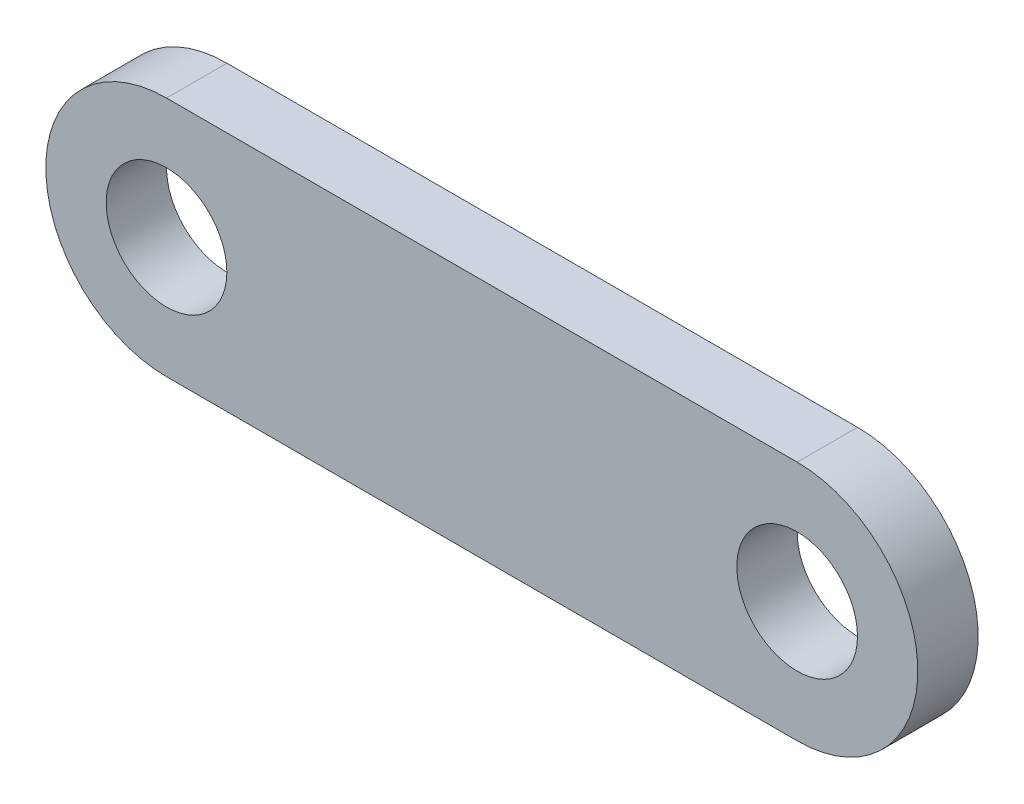
ISO-10303-21;
HEADER;
FILE_DESCRIPTION(('STEP AP214'),'2;1');
FILE_NAME('part.step','',(''),(''),'','','');
FILE_SCHEMA(('AUTOMOTIVE_DESIGN { 1 0 10303 214 1 1 1 1 }'));
ENDSEC;
DATA;
#1=APPLICATION_CONTEXT('core data for automotive mechanical design processes');
#2=APPLICATION_PROTOCOL_DEFINITION('international standard','automotive_design',2000,#1);
#3=PRODUCT_CONTEXT('',#1,'mechanical');
#4=PRODUCT('Part','Part','',(#3));
#5=PRODUCT_RELATED_PRODUCT_CATEGORY('part','',(#4));
#6=PRODUCT_DEFINITION_FORMATION('','',#4);
#7=PRODUCT_DEFINITION_CONTEXT('part definition',#1,'design');
#8=PRODUCT_DEFINITION('design','',#6,#7);
#9=PRODUCT_DEFINITION_SHAPE('','',#8);
#10=(LENGTH_UNIT() NAMED_UNIT(*) SI_UNIT(.MILLI.,.METRE.));
#11=(NAMED_UNIT(*) PLANE_ANGLE_UNIT() SI_UNIT($,.RADIAN.));
#12=(NAMED_UNIT(*) SI_UNIT($,.STERADIAN.) SOLID_ANGLE_UNIT());
#13=UNCERTAINTY_MEASURE_WITH_UNIT(LENGTH_MEASURE(1.E-05),#10,'distance_accuracy_value','');
#14=(GEOMETRIC_REPRESENTATION_CONTEXT(3) GLOBAL_UNCERTAINTY_ASSIGNED_CONTEXT((#13)) GLOBAL_UNIT_ASSIGNED_CONTEXT((#10,
#11,#12)) REPRESENTATION_CONTEXT('',''));
#15=CARTESIAN_POINT('',(0.,0.,0.));
#16=DIRECTION('',(0.,0.,1.));
#17=DIRECTION('',(1.,0.,0.));
#18=AXIS2_PLACEMENT_3D('',#15,#16,#17);
#19=CARTESIAN_POINT('',(5.225,0.,1.));
#20=DIRECTION('',(0.,0.,-1.));
#21=DIRECTION('',(-1.,0.,0.));
#22=AXIS2_PLACEMENT_3D('',#19,#20,#21);
#23=PLANE('',#22);
#24=CARTESIAN_POINT('',(5.225,0.,1.));
#25=DIRECTION('',(0.,0.,1.));
#26=DIRECTION('',(-1.,0.,0.));
#27=AXIS2_PLACEMENT_3D('',#24,#25,#26);
#28=CIRCLE('',#27,2.);
#29=CARTESIAN_POINT('',(5.225,-2.,1.));
#30=VERTEX_POINT('',#29);
#31=CARTESIAN_POINT('',(5.225,2.,1.));
#32=VERTEX_POINT('',#31);
#33=EDGE_CURVE('E96',#30,#32,#28,.T.);
#34=ORIENTED_EDGE('',*,*,#33,.T.);
#35=DIRECTION('',(-1.,0.,0.));
#36=VECTOR('',#35,1.);
#37=CARTESIAN_POINT('',(-5.225,2.,1.));
#38=LINE('',#37,#36);
#39=CARTESIAN_POINT('',(-5.225,2.,1.));
#40=VERTEX_POINT('',#39);
#41=EDGE_CURVE('E91',#32,#40,#38,.T.);
#42=ORIENTED_EDGE('',*,*,#41,.T.);
#43=CARTESIAN_POINT('',(-5.225,0.,1.));
#44=DIRECTION('',(0.,0.,1.));
#45=DIRECTION('',(1.,0.,0.));
#46=AXIS2_PLACEMENT_3D('',#43,#44,#45);
#47=CIRCLE('',#46,2.);
#48=CARTESIAN_POINT('',(-5.225,-2.,1.));
#49=VERTEX_POINT('',#48);
#50=EDGE_CURVE('E94',#40,#49,#47,.T.);
#51=ORIENTED_EDGE('',*,*,#50,.T.);
#52=DIRECTION('',(1.,0.,0.));
#53=VECTOR('',#52,1.);
#54=CARTESIAN_POINT('',(-5.225,-2.,1.));
#55=LINE('',#54,#53);
#56=EDGE_CURVE('E61',#49,#30,#55,.T.);
#57=ORIENTED_EDGE('',*,*,#56,.T.);
#58=EDGE_LOOP('',(#34,#42,#51,#57));
#59=FACE_BOUND('',#58,.T.);
#60=CARTESIAN_POINT('',(-5.225,0.,1.));
#61=DIRECTION('',(0.,0.,1.));
#62=DIRECTION('',(1.,0.,0.));
#63=AXIS2_PLACEMENT_3D('',#60,#61,#62);
#64=CIRCLE('',#63,1.);
#65=CARTESIAN_POINT('',(-4.225,0.,1.));
#66=VERTEX_POINT('',#65);
#67=EDGE_CURVE('E116',#66,#66,#64,.T.);
#68=ORIENTED_EDGE('',*,*,#67,.F.);
#69=EDGE_LOOP('',(#68));
#70=FACE_BOUND('',#69,.T.);
#71=CARTESIAN_POINT('',(5.225,0.,1.));
#72=DIRECTION('',(0.,0.,1.));
#73=DIRECTION('',(1.,0.,0.));
#74=AXIS2_PLACEMENT_3D('',#71,#72,#73);
#75=CIRCLE('',#74,1.);
#76=CARTESIAN_POINT('',(6.225,0.,1.));
#77=VERTEX_POINT('',#76);
#78=EDGE_CURVE('E138',#77,#77,#75,.T.);
#79=ORIENTED_EDGE('',*,*,#78,.F.);
#80=EDGE_LOOP('',(#79));
#81=FACE_BOUND('',#80,.T.);
#82=ADVANCED_FACE('F43',(#59,#70,#81),#23,.F.);
#83=CARTESIAN_POINT('',(5.225,0.,0.));
#84=DIRECTION('',(0.,0.,-1.));
#85=DIRECTION('',(-1.,0.,0.));
#86=AXIS2_PLACEMENT_3D('',#83,#84,#85);
#87=PLANE('',#86);
#88=CARTESIAN_POINT('',(-5.225,0.,0.));
#89=DIRECTION('',(0.,0.,1.));
#90=DIRECTION('',(1.,0.,0.));
#91=AXIS2_PLACEMENT_3D('',#88,#89,#90);
#92=CIRCLE('',#91,1.);
#93=CARTESIAN_POINT('',(-4.225,0.,0.));
#94=VERTEX_POINT('',#93);
#95=EDGE_CURVE('E134',#94,#94,#92,.T.);
#96=ORIENTED_EDGE('',*,*,#95,.T.);
#97=EDGE_LOOP('',(#96));
#98=FACE_BOUND('',#97,.T.);
#99=CARTESIAN_POINT('',(5.225,0.,0.));
#100=DIRECTION('',(0.,0.,1.));
#101=DIRECTION('',(-1.,0.,0.));
#102=AXIS2_PLACEMENT_3D('',#99,#100,#101);
#103=CIRCLE('',#102,2.);
#104=CARTESIAN_POINT('',(5.225,-2.,0.));
#105=VERTEX_POINT('',#104);
#106=CARTESIAN_POINT('',(5.225,2.,0.));
#107=VERTEX_POINT('',#106);
#108=EDGE_CURVE('E112',#105,#107,#103,.T.);
#109=ORIENTED_EDGE('',*,*,#108,.F.);
#110=DIRECTION('',(1.,0.,0.));
#111=VECTOR('',#110,1.);
#112=CARTESIAN_POINT('',(-5.225,-2.,0.));
#113=LINE('',#112,#111);
#114=CARTESIAN_POINT('',(-5.225,-2.,0.));
#115=VERTEX_POINT('',#114);
#116=EDGE_CURVE('E84',#115,#105,#113,.T.);
#117=ORIENTED_EDGE('',*,*,#116,.F.);
#118=CARTESIAN_POINT('',(-5.225,0.,0.));
#119=DIRECTION('',(0.,0.,1.));
#120=DIRECTION('',(1.,0.,0.));
#121=AXIS2_PLACEMENT_3D('',#118,#119,#120);
#122=CIRCLE('',#121,2.);
#123=CARTESIAN_POINT('',(-5.225,2.,0.));
#124=VERTEX_POINT('',#123);
#125=EDGE_CURVE('E78',#124,#115,#122,.T.);
#126=ORIENTED_EDGE('',*,*,#125,.F.);
#127=DIRECTION('',(-1.,0.,0.));
#128=VECTOR('',#127,1.);
#129=CARTESIAN_POINT('',(-5.225,2.,0.));
#130=LINE('',#129,#128);
#131=EDGE_CURVE('E101',#107,#124,#130,.T.);
#132=ORIENTED_EDGE('',*,*,#131,.F.);
#133=EDGE_LOOP('',(#109,#117,#126,#132));
#134=FACE_BOUND('',#133,.T.);
#135=CARTESIAN_POINT('',(5.225,0.,0.));
#136=DIRECTION('',(0.,0.,1.));
#137=DIRECTION('',(1.,0.,0.));
#138=AXIS2_PLACEMENT_3D('',#135,#136,#137);
#139=CIRCLE('',#138,1.);
#140=CARTESIAN_POINT('',(6.225,0.,0.));
#141=VERTEX_POINT('',#140);
#142=EDGE_CURVE('E142',#141,#141,#139,.T.);
#143=ORIENTED_EDGE('',*,*,#142,.T.);
#144=EDGE_LOOP('',(#143));
#145=FACE_BOUND('',#144,.T.);
#146=ADVANCED_FACE('F129',(#98,#134,#145),#87,.T.);
#147=CARTESIAN_POINT('',(5.225,0.,1.));
#148=DIRECTION('',(0.,0.,-1.));
#149=DIRECTION('',(-1.,0.,0.));
#150=AXIS2_PLACEMENT_3D('',#147,#148,#149);
#151=CYLINDRICAL_SURFACE('',#150,2.);
#152=ORIENTED_EDGE('',*,*,#108,.T.);
#153=DIRECTION('',(0.,0.,-1.));
#154=VECTOR('',#153,1.);
#155=CARTESIAN_POINT('',(5.225,2.,1.));
#156=LINE('',#155,#154);
#157=EDGE_CURVE('E11',#32,#107,#156,.T.);
#158=ORIENTED_EDGE('',*,*,#157,.F.);
#159=ORIENTED_EDGE('',*,*,#33,.F.);
#160=DIRECTION('',(0.,0.,-1.));
#161=VECTOR('',#160,1.);
#162=CARTESIAN_POINT('',(5.225,-2.,1.));
#163=LINE('',#162,#161);
#164=EDGE_CURVE('E108',#30,#105,#163,.T.);
#165=ORIENTED_EDGE('',*,*,#164,.T.);
#166=EDGE_LOOP('',(#152,#158,#159,#165));
#167=FACE_BOUND('',#166,.T.);
#168=ADVANCED_FACE('F45',(#167),#151,.T.);
#169=CARTESIAN_POINT('',(-5.225,2.,1.));
#170=DIRECTION('',(0.,-1.,0.));
#171=DIRECTION('',(0.,0.,-1.));
#172=AXIS2_PLACEMENT_3D('',#169,#170,#171);
#173=PLANE('',#172);
#174=ORIENTED_EDGE('',*,*,#131,.T.);
#175=DIRECTION('',(0.,0.,-1.));
#176=VECTOR('',#175,1.);
#177=CARTESIAN_POINT('',(-5.225,2.,1.));
#178=LINE('',#177,#176);
#179=EDGE_CURVE('E53',#40,#124,#178,.T.);
#180=ORIENTED_EDGE('',*,*,#179,.F.);
#181=ORIENTED_EDGE('',*,*,#41,.F.);
#182=ORIENTED_EDGE('',*,*,#157,.T.);
#183=EDGE_LOOP('',(#174,#180,#181,#182));
#184=FACE_BOUND('',#183,.T.);
#185=ADVANCED_FACE('F100',(#184),#173,.F.);
#186=CARTESIAN_POINT('',(-5.225,0.,1.));
#187=DIRECTION('',(0.,0.,-1.));
#188=DIRECTION('',(-1.,0.,0.));
#189=AXIS2_PLACEMENT_3D('',#186,#187,#188);
#190=CYLINDRICAL_SURFACE('',#189,2.);
#191=ORIENTED_EDGE('',*,*,#125,.T.);
#192=DIRECTION('',(0.,0.,-1.));
#193=VECTOR('',#192,1.);
#194=CARTESIAN_POINT('',(-5.225,-2.,1.));
#195=LINE('',#194,#193);
#196=EDGE_CURVE('E103',#49,#115,#195,.T.);
#197=ORIENTED_EDGE('',*,*,#196,.F.);
#198=ORIENTED_EDGE('',*,*,#50,.F.);
#199=ORIENTED_EDGE('',*,*,#179,.T.);
#200=EDGE_LOOP('',(#191,#197,#198,#199));
#201=FACE_BOUND('',#200,.T.);
#202=ADVANCED_FACE('F104',(#201),#190,.T.);
#203=CARTESIAN_POINT('',(-5.225,-2.,1.));
#204=DIRECTION('',(0.,1.,0.));
#205=DIRECTION('',(0.,0.,1.));
#206=AXIS2_PLACEMENT_3D('',#203,#204,#205);
#207=PLANE('',#206);
#208=ORIENTED_EDGE('',*,*,#116,.T.);
#209=ORIENTED_EDGE('',*,*,#164,.F.);
#210=ORIENTED_EDGE('',*,*,#56,.F.);
#211=ORIENTED_EDGE('',*,*,#196,.T.);
#212=EDGE_LOOP('',(#208,#209,#210,#211));
#213=FACE_BOUND('',#212,.T.);
#214=ADVANCED_FACE('F126',(#213),#207,.F.);
#215=CARTESIAN_POINT('',(-5.225,0.,1.));
#216=DIRECTION('',(0.,0.,-1.));
#217=DIRECTION('',(-1.,0.,0.));
#218=AXIS2_PLACEMENT_3D('',#215,#216,#217);
#219=CYLINDRICAL_SURFACE('',#218,1.);
#220=ORIENTED_EDGE('',*,*,#67,.T.);
#221=EDGE_LOOP('',(#220));
#222=FACE_BOUND('',#221,.T.);
#223=ORIENTED_EDGE('',*,*,#95,.F.);
#224=EDGE_LOOP('',(#223));
#225=FACE_BOUND('',#224,.T.);
#226=ADVANCED_FACE('F161',(#222,#225),#219,.F.);
#227=CARTESIAN_POINT('',(5.225,0.,1.));
#228=DIRECTION('',(0.,0.,-1.));
#229=DIRECTION('',(-1.,0.,0.));
#230=AXIS2_PLACEMENT_3D('',#227,#228,#229);
#231=CYLINDRICAL_SURFACE('',#230,1.);
#232=ORIENTED_EDGE('',*,*,#78,.T.);
#233=EDGE_LOOP('',(#232));
#234=FACE_BOUND('',#233,.T.);
#235=ORIENTED_EDGE('',*,*,#142,.F.);
#236=EDGE_LOOP('',(#235));
#237=FACE_BOUND('',#236,.T.);
#238=ADVANCED_FACE('F150',(#234,#237),#231,.F.);
#239=CLOSED_SHELL('',(#82,#146,#168,#185,#202,#214,#226,#238));
#240=MANIFOLD_SOLID_BREP('B2',#239);
#241=ADVANCED_BREP_SHAPE_REPRESENTATION('',(#18,#240),#14);
#242=SHAPE_DEFINITION_REPRESENTATION(#9,#241);
ENDSEC;
END-ISO-10303-21;
